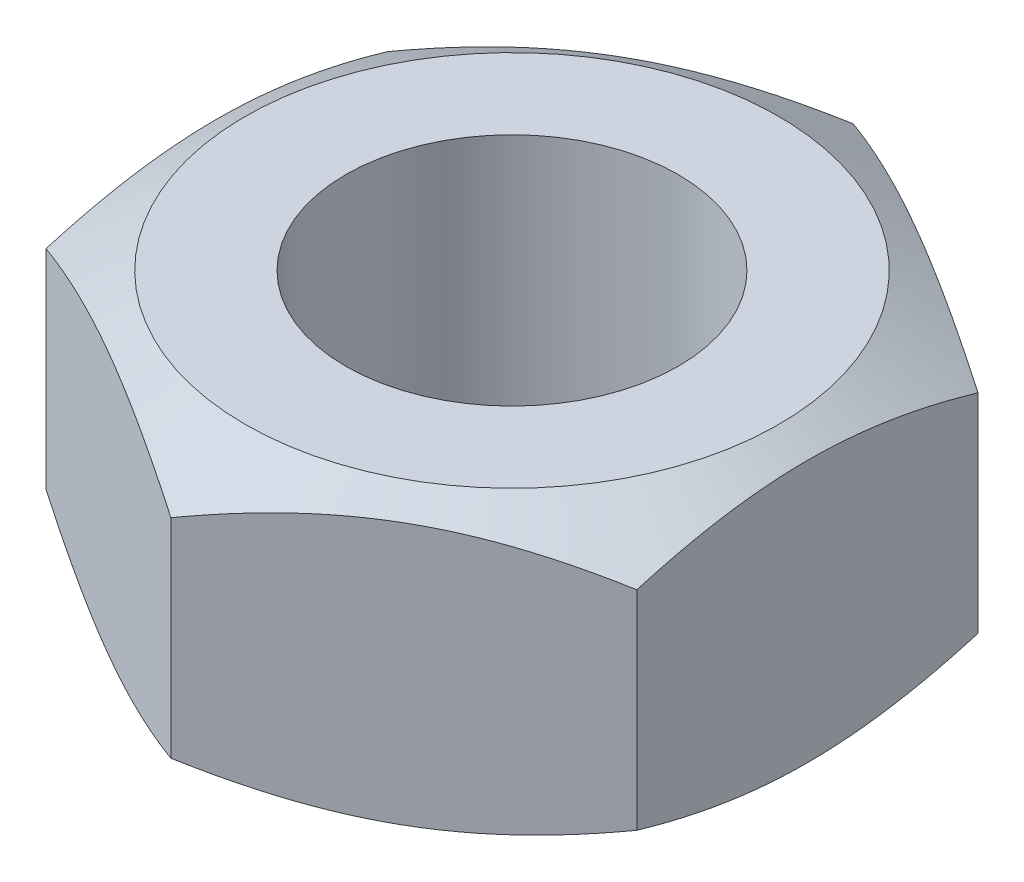
ISO-10303-21;
HEADER;
FILE_DESCRIPTION(('STEP AP214'),'2;1');
FILE_NAME('part.step','',(''),(''),'','','');
FILE_SCHEMA(('AUTOMOTIVE_DESIGN { 1 0 10303 214 1 1 1 1 }'));
ENDSEC;
DATA;
#1=APPLICATION_CONTEXT('core data for automotive mechanical design processes');
#2=APPLICATION_PROTOCOL_DEFINITION('international standard','automotive_design',2000,#1);
#3=PRODUCT_CONTEXT('',#1,'mechanical');
#4=PRODUCT('Part','Part','',(#3));
#5=PRODUCT_RELATED_PRODUCT_CATEGORY('part','',(#4));
#6=PRODUCT_DEFINITION_FORMATION('','',#4);
#7=PRODUCT_DEFINITION_CONTEXT('part definition',#1,'design');
#8=PRODUCT_DEFINITION('design','',#6,#7);
#9=PRODUCT_DEFINITION_SHAPE('','',#8);
#10=(LENGTH_UNIT() NAMED_UNIT(*) SI_UNIT(.MILLI.,.METRE.));
#11=(NAMED_UNIT(*) PLANE_ANGLE_UNIT() SI_UNIT($,.RADIAN.));
#12=(NAMED_UNIT(*) SI_UNIT($,.STERADIAN.) SOLID_ANGLE_UNIT());
#13=UNCERTAINTY_MEASURE_WITH_UNIT(LENGTH_MEASURE(1.E-05),#10,'distance_accuracy_value','');
#14=(GEOMETRIC_REPRESENTATION_CONTEXT(3) GLOBAL_UNCERTAINTY_ASSIGNED_CONTEXT((#13)) GLOBAL_UNIT_ASSIGNED_CONTEXT((#10,
#11,#12)) REPRESENTATION_CONTEXT('',''));
#15=CARTESIAN_POINT('',(0.,0.,0.));
#16=DIRECTION('',(0.,0.,1.));
#17=DIRECTION('',(1.,0.,0.));
#18=AXIS2_PLACEMENT_3D('',#15,#16,#17);
#19=CARTESIAN_POINT('',(0.,4.,0.));
#20=DIRECTION('',(0.,1.,0.));
#21=DIRECTION('',(0.,0.,1.));
#22=AXIS2_PLACEMENT_3D('',#19,#20,#21);
#23=PLANE('',#22);
#24=CARTESIAN_POINT('',(0.,4.,0.));
#25=DIRECTION('',(0.,1.,0.));
#26=DIRECTION('',(0.,0.,1.));
#27=AXIS2_PLACEMENT_3D('',#24,#25,#26);
#28=CIRCLE('',#27,2.25);
#29=CARTESIAN_POINT('',(0.,4.,2.25));
#30=VERTEX_POINT('',#29);
#31=EDGE_CURVE('E117',#30,#30,#28,.T.);
#32=ORIENTED_EDGE('',*,*,#31,.F.);
#33=EDGE_LOOP('',(#32));
#34=FACE_BOUND('',#33,.T.);
#35=CARTESIAN_POINT('',(0.,4.,0.));
#36=DIRECTION('',(0.,1.,0.));
#37=DIRECTION('',(0.,0.,1.));
#38=AXIS2_PLACEMENT_3D('',#35,#36,#37);
#39=CIRCLE('',#38,3.61209797008557);
#40=CARTESIAN_POINT('',(0.,4.,3.61209797008557));
#41=VERTEX_POINT('',#40);
#42=EDGE_CURVE('E206',#41,#41,#39,.F.);
#43=ORIENTED_EDGE('',*,*,#42,.F.);
#44=EDGE_LOOP('',(#43));
#45=FACE_BOUND('',#44,.T.);
#46=ADVANCED_FACE('F37',(#34,#45),#23,.T.);
#47=CARTESIAN_POINT('',(0.,0.,0.));
#48=DIRECTION('',(0.,1.,0.));
#49=DIRECTION('',(0.,0.,1.));
#50=AXIS2_PLACEMENT_3D('',#47,#48,#49);
#51=PLANE('',#50);
#52=CARTESIAN_POINT('',(0.,0.,0.));
#53=DIRECTION('',(0.,1.,0.));
#54=DIRECTION('',(0.,0.,1.));
#55=AXIS2_PLACEMENT_3D('',#52,#53,#54);
#56=CIRCLE('',#55,2.25);
#57=CARTESIAN_POINT('',(0.,0.,2.25));
#58=VERTEX_POINT('',#57);
#59=EDGE_CURVE('E209',#58,#58,#56,.T.);
#60=ORIENTED_EDGE('',*,*,#59,.T.);
#61=EDGE_LOOP('',(#60));
#62=FACE_BOUND('',#61,.T.);
#63=CARTESIAN_POINT('',(0.,0.,0.));
#64=DIRECTION('',(0.,1.,0.));
#65=DIRECTION('',(0.,0.,1.));
#66=AXIS2_PLACEMENT_3D('',#63,#64,#65);
#67=CIRCLE('',#66,3.61209797008557);
#68=CARTESIAN_POINT('',(0.,0.,3.61209797008557));
#69=VERTEX_POINT('',#68);
#70=EDGE_CURVE('E240',#69,#69,#67,.F.);
#71=ORIENTED_EDGE('',*,*,#70,.T.);
#72=EDGE_LOOP('',(#71));
#73=FACE_BOUND('',#72,.T.);
#74=ADVANCED_FACE('F214',(#62,#73),#51,.F.);
#75=CARTESIAN_POINT('',(0.,4.,0.));
#76=DIRECTION('',(0.,-1.,0.));
#77=DIRECTION('',(0.,0.,-1.));
#78=AXIS2_PLACEMENT_3D('',#75,#76,#77);
#79=CYLINDRICAL_SURFACE('',#78,2.25);
#80=ORIENTED_EDGE('',*,*,#31,.T.);
#81=EDGE_LOOP('',(#80));
#82=FACE_BOUND('',#81,.T.);
#83=ORIENTED_EDGE('',*,*,#59,.F.);
#84=EDGE_LOOP('',(#83));
#85=FACE_BOUND('',#84,.T.);
#86=ADVANCED_FACE('F139',(#82,#85),#79,.F.);
#87=CARTESIAN_POINT('',(0.,-0.68376443772911,0.));
#88=DIRECTION('',(0.,1.,0.));
#89=DIRECTION('',(0.,0.,1.));
#90=AXIS2_PLACEMENT_3D('',#87,#88,#89);
#91=CONICAL_SURFACE('',#90,2.4447269690735,1.0409354159188);
#92=CARTESIAN_POINT('',(4.,2.61028718759325,7.00726327897921));
#93=CARTESIAN_POINT('',(4.,2.52639827824864,6.84232589552048));
#94=CARTESIAN_POINT('',(4.,2.44306760311003,6.67710171603951));
#95=CARTESIAN_POINT('',(4.,2.27779120456628,6.3459563996271));
#96=CARTESIAN_POINT('',(4.,2.19584552263047,6.1800352420119));
#97=CARTESIAN_POINT('',(4.,2.03345876510597,5.84706693247022));
#98=CARTESIAN_POINT('',(4.,1.95302083859972,5.68001824163056));
#99=CARTESIAN_POINT('',(4.,1.79417526159156,5.34495366362033));
#100=CARTESIAN_POINT('',(4.,1.71576764042466,5.17693776251778));
#101=CARTESIAN_POINT('',(4.,1.55789573304698,4.83199690750797));
#102=CARTESIAN_POINT('',(4.,1.47854903734373,4.65501796380072));
#103=CARTESIAN_POINT('',(4.,1.32328560860535,4.29956340195523));
#104=CARTESIAN_POINT('',(4.,1.24736876337757,4.12108783299931));
#105=CARTESIAN_POINT('',(4.,1.09993305319936,3.76247333013967));
#106=CARTESIAN_POINT('',(4.,1.02841096395531,3.58233572997014));
#107=CARTESIAN_POINT('',(4.,0.890895088142785,3.21989853901179));
#108=CARTESIAN_POINT('',(4.,0.824902765013513,3.03759839039016));
#109=CARTESIAN_POINT('',(4.,0.685758042436417,2.62861099875536));
#110=CARTESIAN_POINT('',(4.,0.614413825843176,2.40129732545409));
#111=CARTESIAN_POINT('',(4.,0.486235081572712,1.94267549399183));
#112=CARTESIAN_POINT('',(4.,0.429392492990072,1.71136963161924));
#113=CARTESIAN_POINT('',(4.,0.335503107936436,1.24874583177107));
#114=CARTESIAN_POINT('',(4.,0.298133387909005,1.01749619795472));
#115=CARTESIAN_POINT('',(4.,0.258784993512926,0.668801688350013));
#116=CARTESIAN_POINT('',(4.,0.248453307084588,0.552271632402245));
#117=CARTESIAN_POINT('',(4.,0.233656567288959,0.318845081866252));
#118=CARTESIAN_POINT('',(4.,0.229190743544397,0.201948637418405));
#119=CARTESIAN_POINT('',(4.,0.226267362822431,-0.0328811107374999));
#120=CARTESIAN_POINT('',(4.,0.227859552541684,-0.150815030619628));
#121=CARTESIAN_POINT('',(4.,0.237107225154616,-0.386443176088084));
#122=CARTESIAN_POINT('',(4.,0.244762746675399,-0.504137400142615));
#123=CARTESIAN_POINT('',(4.,0.26588840700443,-0.73903203220059));
#124=CARTESIAN_POINT('',(4.,0.27936018176286,-0.856232291893325));
#125=CARTESIAN_POINT('',(4.,0.311708432806887,-1.0898907321352));
#126=CARTESIAN_POINT('',(4.,0.330585690262064,-1.20634880293898));
#127=CARTESIAN_POINT('',(4.,0.39532456241445,-1.55845850653768));
#128=CARTESIAN_POINT('',(4.,0.448891679379593,-1.79270738631452));
#129=CARTESIAN_POINT('',(4.,0.57168084833591,-2.25695035701157));
#130=CARTESIAN_POINT('',(4.,0.640904747324168,-2.4869439424781));
#131=CARTESIAN_POINT('',(4.,0.778494266831522,-2.90519380379463));
#132=CARTESIAN_POINT('',(4.,0.845094289386991,-3.09403992717374));
#133=CARTESIAN_POINT('',(4.,0.984552173797888,-3.46941862759845));
#134=CARTESIAN_POINT('',(4.,1.05741084236691,-3.65595090284177));
#135=CARTESIAN_POINT('',(4.,1.2080196332473,-4.02716204183718));
#136=CARTESIAN_POINT('',(4.,1.28577297789606,-4.21183958981844));
#137=CARTESIAN_POINT('',(4.,1.4450720715363,-4.57955338136123));
#138=CARTESIAN_POINT('',(4.,1.52661796781677,-4.76258956084811));
#139=CARTESIAN_POINT('',(4.,1.68892399921445,-5.11899619775736));
#140=CARTESIAN_POINT('',(4.,1.76955103188059,-5.29242747885545));
#141=CARTESIAN_POINT('',(4.,1.93300933732775,-5.6382507194435));
#142=CARTESIAN_POINT('',(4.,2.01584065798741,-5.81064265625827));
#143=CARTESIAN_POINT('',(4.,2.1831068753491,-6.15416446950149));
#144=CARTESIAN_POINT('',(4.,2.26753773800244,-6.32529631447043));
#145=CARTESIAN_POINT('',(4.,2.43787752539434,-6.66680796247699));
#146=CARTESIAN_POINT('',(4.,2.52378634336737,-6.83718781872926));
#147=CARTESIAN_POINT('',(4.,2.61028718759325,-7.00726327897921));
#148=B_SPLINE_CURVE_WITH_KNOTS('',3,(#92,#93,#94,#95,#96,#97,#98,#99,#100,#101,#102,#103,#104,
#105,#106,#107,#108,#109,#110,#111,#112,#113,#114,#115,#116,#117,#118,#119,#120,#121,#122,#123,
#124,#125,#126,#127,#128,#129,#130,#131,#132,#133,#134,#135,#136,#137,#138,#139,#140,#141,#142,
#143,#144,#145,#146,#147),.UNSPECIFIED.,.F.,.F.,(4,2,2,2,2,2,2,2,2,2,2,2,2,2,2,2,2,2,2,2,2,2,2,
2,2,2,2,4),(0.,0.555138054664007,1.11029270186784,1.66650046328751,2.22271625663643,
2.80454385050609,3.38635239861735,3.96772886607925,4.54925871064816,5.26363404959649,
5.97761142488807,6.67933831072323,7.03017313355102,7.3809618758241,7.73463738899631,
8.08831515531428,8.44209246622222,8.79592092883722,9.51600624319177,10.2361765488178,
10.8367810583951,11.4374630999085,12.0385448130504,12.6396498895591,13.2134015875616,
13.7871657580345,14.3596370232447,14.9320671061052),.UNSPECIFIED.);
#149=CARTESIAN_POINT('',(4.,0.58965703220853,2.3094010767592));
#150=VERTEX_POINT('',#149);
#151=CARTESIAN_POINT('',(4.,0.589657032208923,-2.3094010767585));
#152=VERTEX_POINT('',#151);
#153=EDGE_CURVE('E52',#150,#152,#148,.T.);
#154=ORIENTED_EDGE('',*,*,#153,.F.);
#155=CARTESIAN_POINT('',(-0.000200000000001371,0.589724669041671,4.61891762357084));
#156=CARTESIAN_POINT('',(0.175804831431018,0.530183688208346,4.51730118676547));
#157=CARTESIAN_POINT('',(0.353373387179112,0.476024892513993,4.4147819333047));
#158=CARTESIAN_POINT('',(0.711678957166684,0.381500126417072,4.20791411602023));
#159=CARTESIAN_POINT('',(0.892422759342489,0.341168832353252,4.10356163317967));
#160=CARTESIAN_POINT('',(1.25160420033593,0.278464674315939,3.89618813153419));
#161=CARTESIAN_POINT('',(1.42998324919891,0.255660398584664,3.79320093965536));
#162=CARTESIAN_POINT('',(1.78759849441755,0.228537723528707,3.58673168156206));
#163=CARTESIAN_POINT('',(1.96683330903635,0.224195807285599,3.48325041309375));
#164=CARTESIAN_POINT('',(2.30117127720475,0.233694291050728,3.29022029717141));
#165=CARTESIAN_POINT('',(2.45632863986722,0.245204283483477,3.20064015207148));
#166=CARTESIAN_POINT('',(2.76560140614868,0.281529574357058,3.02208143720586));
#167=CARTESIAN_POINT('',(2.91971567223493,0.306357578340221,2.933103524195));
#168=CARTESIAN_POINT('',(3.22963813865317,0.368367007743517,2.75416970478052));
#169=CARTESIAN_POINT('',(3.3854049694151,0.405816924592417,2.66423768310931));
#170=CARTESIAN_POINT('',(3.69455409582105,0.490760079003086,2.48575035175909));
#171=CARTESIAN_POINT('',(3.84794058217129,0.538232820830941,2.39719262257473));
#172=CARTESIAN_POINT('',(4.0002,0.589724669041671,2.30928560670467));
#173=B_SPLINE_CURVE_WITH_KNOTS('',3,(#155,#156,#157,#158,#159,#160,#161,#162,#163,#164,#165,
#166,#167,#168,#169,#170,#171,#172),.UNSPECIFIED.,.F.,.F.,(4,2,2,2,2,2,2,2,4),(0.,
0.63558616227486,1.27275477200873,1.89368771411415,2.51382948909345,3.05189428800758,
3.5904733225053,4.14131948105499,4.69104993616021),.UNSPECIFIED.);
#174=CARTESIAN_POINT('',(0.,0.589657032208924,4.61880215351701));
#175=VERTEX_POINT('',#174);
#176=EDGE_CURVE('E96',#175,#150,#173,.T.);
#177=ORIENTED_EDGE('',*,*,#176,.F.);
#178=CARTESIAN_POINT('',(-4.0002,0.589724669041671,2.30928560670467));
#179=CARTESIAN_POINT('',(-3.82419516856898,0.530183688208346,2.41090204351004));
#180=CARTESIAN_POINT('',(-3.64662661282089,0.476024892513993,2.51342129697081));
#181=CARTESIAN_POINT('',(-3.28832104283331,0.381500126417072,2.72028911425528));
#182=CARTESIAN_POINT('',(-3.10757724065751,0.341168832353252,2.82464159709584));
#183=CARTESIAN_POINT('',(-2.74839579966407,0.278464674315939,3.03201509874132));
#184=CARTESIAN_POINT('',(-2.57001675080109,0.255660398584665,3.13500229062015));
#185=CARTESIAN_POINT('',(-2.21240150558245,0.228537723528707,3.34147154871344));
#186=CARTESIAN_POINT('',(-2.03316669096365,0.224195807285599,3.44495281718176));
#187=CARTESIAN_POINT('',(-1.69882872279525,0.233694291050728,3.6379829331041));
#188=CARTESIAN_POINT('',(-1.54367136013278,0.245204283483477,3.72756307820403));
#189=CARTESIAN_POINT('',(-1.23439859385132,0.281529574357058,3.90612179306965));
#190=CARTESIAN_POINT('',(-1.08028432776507,0.306357578340222,3.99509970608051));
#191=CARTESIAN_POINT('',(-0.770361861346834,0.368367007743517,4.17403352549499));
#192=CARTESIAN_POINT('',(-0.614595030584906,0.405816924592416,4.26396554716621));
#193=CARTESIAN_POINT('',(-0.305445904178949,0.490760079003085,4.44245287851642));
#194=CARTESIAN_POINT('',(-0.152059417828715,0.538232820830941,4.53101060770078));
#195=CARTESIAN_POINT('',(0.000199999999997758,0.589724669041671,4.61891762357084));
#196=B_SPLINE_CURVE_WITH_KNOTS('',3,(#178,#179,#180,#181,#182,#183,#184,#185,#186,#187,#188,
#189,#190,#191,#192,#193,#194,#195),.UNSPECIFIED.,.F.,.F.,(4,2,2,2,2,2,2,2,4),(0.,
0.63558616227486,1.27275477200874,1.89368771411415,2.51382948909345,3.05189428800758,
3.5904733225053,4.14131948105499,4.69104993616021),.UNSPECIFIED.);
#197=CARTESIAN_POINT('',(-4.,0.589657032208924,2.3094010767585));
#198=VERTEX_POINT('',#197);
#199=EDGE_CURVE('E110',#198,#175,#196,.T.);
#200=ORIENTED_EDGE('',*,*,#199,.F.);
#201=CARTESIAN_POINT('',(-4.,2.61028718759325,-7.00726327897921));
#202=CARTESIAN_POINT('',(-4.,2.52639827824864,-6.84232589552048));
#203=CARTESIAN_POINT('',(-4.,2.44306760311003,-6.6771017160395));
#204=CARTESIAN_POINT('',(-4.,2.27779120456628,-6.3459563996271));
#205=CARTESIAN_POINT('',(-4.,2.19584552263047,-6.1800352420119));
#206=CARTESIAN_POINT('',(-4.,2.03345876510597,-5.84706693247022));
#207=CARTESIAN_POINT('',(-4.,1.95302083859972,-5.68001824163056));
#208=CARTESIAN_POINT('',(-4.,1.79417526159156,-5.34495366362033));
#209=CARTESIAN_POINT('',(-4.,1.71576764042466,-5.17693776251777));
#210=CARTESIAN_POINT('',(-4.,1.55789573304698,-4.83199690750797));
#211=CARTESIAN_POINT('',(-4.,1.47854903734373,-4.65501796380072));
#212=CARTESIAN_POINT('',(-4.,1.32328560860535,-4.29956340195523));
#213=CARTESIAN_POINT('',(-4.,1.24736876337757,-4.12108783299931));
#214=CARTESIAN_POINT('',(-4.,1.09993305319936,-3.76247333013967));
#215=CARTESIAN_POINT('',(-4.,1.02841096395531,-3.58233572997014));
#216=CARTESIAN_POINT('',(-4.,0.890895088142785,-3.21989853901179));
#217=CARTESIAN_POINT('',(-4.,0.824902765013513,-3.03759839039016));
#218=CARTESIAN_POINT('',(-4.,0.685758042436418,-2.62861099875536));
#219=CARTESIAN_POINT('',(-4.,0.614413825843176,-2.4012973254541));
#220=CARTESIAN_POINT('',(-4.,0.486235081572713,-1.94267549399183));
#221=CARTESIAN_POINT('',(-4.,0.429392492990072,-1.71136963161925));
#222=CARTESIAN_POINT('',(-4.,0.335503107936436,-1.24874583177107));
#223=CARTESIAN_POINT('',(-4.,0.298133387909005,-1.01749619795472));
#224=CARTESIAN_POINT('',(-4.,0.258784993512926,-0.668801688350014));
#225=CARTESIAN_POINT('',(-4.,0.248453307084588,-0.552271632402245));
#226=CARTESIAN_POINT('',(-4.,0.233656567288959,-0.318845081866252));
#227=CARTESIAN_POINT('',(-4.,0.229190743544397,-0.201948637418404));
#228=CARTESIAN_POINT('',(-4.,0.226267362822432,0.0328811107375005));
#229=CARTESIAN_POINT('',(-4.,0.227859552541684,0.150815030619629));
#230=CARTESIAN_POINT('',(-4.,0.237107225154617,0.386443176088085));
#231=CARTESIAN_POINT('',(-4.,0.244762746675399,0.504137400142616));
#232=CARTESIAN_POINT('',(-4.,0.265888407004431,0.739032032200591));
#233=CARTESIAN_POINT('',(-4.,0.27936018176286,0.856232291893325));
#234=CARTESIAN_POINT('',(-4.,0.311708432806887,1.0898907321352));
#235=CARTESIAN_POINT('',(-4.,0.330585690262065,1.20634880293898));
#236=CARTESIAN_POINT('',(-4.,0.395324562414451,1.55845850653768));
#237=CARTESIAN_POINT('',(-4.,0.448891679379594,1.79270738631452));
#238=CARTESIAN_POINT('',(-4.,0.57168084833591,2.25695035701158));
#239=CARTESIAN_POINT('',(-4.,0.640904747324168,2.4869439424781));
#240=CARTESIAN_POINT('',(-4.,0.778494266831523,2.90519380379463));
#241=CARTESIAN_POINT('',(-4.,0.845094289386992,3.09403992717374));
#242=CARTESIAN_POINT('',(-4.,0.984552173797889,3.46941862759846));
#243=CARTESIAN_POINT('',(-4.,1.05741084236691,3.65595090284178));
#244=CARTESIAN_POINT('',(-4.,1.2080196332473,4.02716204183718));
#245=CARTESIAN_POINT('',(-4.,1.28577297789607,4.21183958981844));
#246=CARTESIAN_POINT('',(-4.,1.4450720715363,4.57955338136123));
#247=CARTESIAN_POINT('',(-4.,1.52661796781677,4.76258956084811));
#248=CARTESIAN_POINT('',(-4.,1.68892399921445,5.11899619775736));
#249=CARTESIAN_POINT('',(-4.,1.76955103188059,5.29242747885545));
#250=CARTESIAN_POINT('',(-4.,1.93300933732775,5.63825071944351));
#251=CARTESIAN_POINT('',(-4.,2.01584065798741,5.81064265625827));
#252=CARTESIAN_POINT('',(-4.,2.1831068753491,6.15416446950149));
#253=CARTESIAN_POINT('',(-4.,2.26753773800244,6.32529631447043));
#254=CARTESIAN_POINT('',(-4.,2.43787752539435,6.66680796247699));
#255=CARTESIAN_POINT('',(-4.,2.52378634336737,6.83718781872926));
#256=CARTESIAN_POINT('',(-4.,2.61028718759325,7.00726327897921));
#257=B_SPLINE_CURVE_WITH_KNOTS('',3,(#201,#202,#203,#204,#205,#206,#207,#208,#209,#210,#211,
#212,#213,#214,#215,#216,#217,#218,#219,#220,#221,#222,#223,#224,#225,#226,#227,#228,#229,#230,
#231,#232,#233,#234,#235,#236,#237,#238,#239,#240,#241,#242,#243,#244,#245,#246,#247,#248,#249,
#250,#251,#252,#253,#254,#255,#256),.UNSPECIFIED.,.F.,.F.,(4,2,2,2,2,2,2,2,2,2,2,2,2,2,2,2,2,2,
2,2,2,2,2,2,2,2,2,4),(0.,0.555138054664008,1.11029270186784,1.66650046328751,2.22271625663643,
2.80454385050609,3.38635239861735,3.96772886607925,4.54925871064816,5.26363404959649,
5.97761142488807,6.67933831072323,7.03017313355102,7.3809618758241,7.73463738899631,
8.08831515531429,8.44209246622223,8.79592092883722,9.51600624319177,10.2361765488178,
10.8367810583951,11.4374630999086,12.0385448130504,12.6396498895591,13.2134015875616,
13.7871657580345,14.3596370232447,14.9320671061052),.UNSPECIFIED.);
#258=CARTESIAN_POINT('',(-4.,0.58965703220853,-2.3094010767592));
#259=VERTEX_POINT('',#258);
#260=EDGE_CURVE('E159',#259,#198,#257,.T.);
#261=ORIENTED_EDGE('',*,*,#260,.F.);
#262=CARTESIAN_POINT('',(0.000199999999999149,0.589724669041671,-4.61891762357084));
#263=CARTESIAN_POINT('',(-0.17580483143102,0.530183688208346,-4.51730118676547));
#264=CARTESIAN_POINT('',(-0.353373387179115,0.476024892513993,-4.4147819333047));
#265=CARTESIAN_POINT('',(-0.711678957166686,0.381500126417072,-4.20791411602023));
#266=CARTESIAN_POINT('',(-0.892422759342491,0.341168832353251,-4.10356163317967));
#267=CARTESIAN_POINT('',(-1.25160420033593,0.278464674315939,-3.89618813153419));
#268=CARTESIAN_POINT('',(-1.42998324919891,0.255660398584664,-3.79320093965536));
#269=CARTESIAN_POINT('',(-1.78759849441755,0.228537723528707,-3.58673168156207));
#270=CARTESIAN_POINT('',(-1.96683330903635,0.224195807285599,-3.48325041309375));
#271=CARTESIAN_POINT('',(-2.30117127720475,0.233694291050729,-3.29022029717141));
#272=CARTESIAN_POINT('',(-2.45632863986722,0.245204283483477,-3.20064015207148));
#273=CARTESIAN_POINT('',(-2.76560140614868,0.281529574357059,-3.02208143720586));
#274=CARTESIAN_POINT('',(-2.91971567223494,0.306357578340222,-2.933103524195));
#275=CARTESIAN_POINT('',(-3.22963813865317,0.368367007743518,-2.75416970478052));
#276=CARTESIAN_POINT('',(-3.3854049694151,0.405816924592417,-2.66423768310931));
#277=CARTESIAN_POINT('',(-3.69455409582105,0.490760079003086,-2.48575035175909));
#278=CARTESIAN_POINT('',(-3.84794058217129,0.538232820830941,-2.39719262257473));
#279=CARTESIAN_POINT('',(-4.0002,0.589724669041671,-2.30928560670467));
#280=B_SPLINE_CURVE_WITH_KNOTS('',3,(#262,#263,#264,#265,#266,#267,#268,#269,#270,#271,#272,
#273,#274,#275,#276,#277,#278,#279),.UNSPECIFIED.,.F.,.F.,(4,2,2,2,2,2,2,2,4),(0.,
0.63558616227486,1.27275477200874,1.89368771411415,2.51382948909345,3.05189428800758,
3.5904733225053,4.14131948105499,4.69104993616021),.UNSPECIFIED.);
#281=CARTESIAN_POINT('',(0.,0.589657032208924,-4.61880215351701));
#282=VERTEX_POINT('',#281);
#283=EDGE_CURVE('E166',#282,#259,#280,.T.);
#284=ORIENTED_EDGE('',*,*,#283,.F.);
#285=CARTESIAN_POINT('',(4.0002,0.589724669041671,-2.30928560670467));
#286=CARTESIAN_POINT('',(3.82419516856898,0.530183688208345,-2.41090204351004));
#287=CARTESIAN_POINT('',(3.64662661282088,0.476024892513993,-2.51342129697082));
#288=CARTESIAN_POINT('',(3.28832104283331,0.381500126417071,-2.72028911425528));
#289=CARTESIAN_POINT('',(3.10757724065751,0.341168832353251,-2.82464159709584));
#290=CARTESIAN_POINT('',(2.74839579966407,0.278464674315939,-3.03201509874132));
#291=CARTESIAN_POINT('',(2.57001675080109,0.255660398584664,-3.13500229062015));
#292=CARTESIAN_POINT('',(2.21240150558245,0.228537723528707,-3.34147154871344));
#293=CARTESIAN_POINT('',(2.03316669096365,0.224195807285599,-3.44495281718176));
#294=CARTESIAN_POINT('',(1.69882872279525,0.233694291050728,-3.6379829331041));
#295=CARTESIAN_POINT('',(1.54367136013278,0.245204283483477,-3.72756307820403));
#296=CARTESIAN_POINT('',(1.23439859385132,0.281529574357058,-3.90612179306965));
#297=CARTESIAN_POINT('',(1.08028432776506,0.306357578340221,-3.99509970608051));
#298=CARTESIAN_POINT('',(0.770361861346831,0.368367007743517,-4.17403352549499));
#299=CARTESIAN_POINT('',(0.614595030584903,0.405816924592416,-4.26396554716621));
#300=CARTESIAN_POINT('',(0.305445904178946,0.490760079003085,-4.44245287851642));
#301=CARTESIAN_POINT('',(0.152059417828711,0.53823282083094,-4.53101060770078));
#302=CARTESIAN_POINT('',(-0.000200000000000805,0.589724669041671,-4.61891762357084));
#303=B_SPLINE_CURVE_WITH_KNOTS('',3,(#285,#286,#287,#288,#289,#290,#291,#292,#293,#294,#295,
#296,#297,#298,#299,#300,#301,#302),.UNSPECIFIED.,.F.,.F.,(4,2,2,2,2,2,2,2,4),(0.,
0.63558616227486,1.27275477200873,1.89368771411415,2.51382948909345,3.05189428800758,
3.5904733225053,4.14131948105499,4.69104993616021),.UNSPECIFIED.);
#304=EDGE_CURVE('E66',#152,#282,#303,.T.);
#305=ORIENTED_EDGE('',*,*,#304,.F.);
#306=EDGE_LOOP('',(#154,#177,#200,#261,#284,#305));
#307=FACE_BOUND('',#306,.T.);
#308=ORIENTED_EDGE('',*,*,#70,.F.);
#309=EDGE_LOOP('',(#308));
#310=FACE_BOUND('',#309,.T.);
#311=ADVANCED_FACE('F94',(#307,#310),#91,.T.);
#312=CARTESIAN_POINT('',(0.,3.14285541894045,0.));
#313=DIRECTION('',(0.,-1.,0.));
#314=DIRECTION('',(0.,0.,-1.));
#315=AXIS2_PLACEMENT_3D('',#312,#313,#314);
#316=CONICAL_SURFACE('',#315,5.07547581249973,1.0409354159188);
#317=ORIENTED_EDGE('',*,*,#42,.T.);
#318=EDGE_LOOP('',(#317));
#319=FACE_BOUND('',#318,.T.);
#320=CARTESIAN_POINT('',(-4.0002,3.41027533095833,-2.30928560670467));
#321=CARTESIAN_POINT('',(-3.82419516856898,3.46981631179165,-2.41090204351004));
#322=CARTESIAN_POINT('',(-3.64662661282089,3.52397510748601,-2.51342129697082));
#323=CARTESIAN_POINT('',(-3.28832104283331,3.61849987358293,-2.72028911425528));
#324=CARTESIAN_POINT('',(-3.10757724065751,3.65883116764675,-2.82464159709584));
#325=CARTESIAN_POINT('',(-2.74839579966407,3.72153532568406,-3.03201509874132));
#326=CARTESIAN_POINT('',(-2.57001675080109,3.74433960141534,-3.13500229062015));
#327=CARTESIAN_POINT('',(-2.21240150558245,3.77146227647129,-3.34147154871345));
#328=CARTESIAN_POINT('',(-2.03316669096365,3.7758041927144,-3.44495281718176));
#329=CARTESIAN_POINT('',(-1.69882872279525,3.76630570894927,-3.6379829331041));
#330=CARTESIAN_POINT('',(-1.54367136013278,3.75479571651652,-3.72756307820403));
#331=CARTESIAN_POINT('',(-1.23439859385132,3.71847042564294,-3.90612179306965));
#332=CARTESIAN_POINT('',(-1.08028432776507,3.69364242165978,-3.99509970608051));
#333=CARTESIAN_POINT('',(-0.770361861346833,3.63163299225648,-4.17403352549499));
#334=CARTESIAN_POINT('',(-0.614595030584905,3.59418307540758,-4.26396554716621));
#335=CARTESIAN_POINT('',(-0.305445904178948,3.50923992099692,-4.44245287851642));
#336=CARTESIAN_POINT('',(-0.152059417828713,3.46176717916906,-4.53101060770078));
#337=CARTESIAN_POINT('',(0.000199999999998861,3.41027533095833,-4.61891762357084));
#338=B_SPLINE_CURVE_WITH_KNOTS('',3,(#320,#321,#322,#323,#324,#325,#326,#327,#328,#329,#330,
#331,#332,#333,#334,#335,#336,#337),.UNSPECIFIED.,.F.,.F.,(4,2,2,2,2,2,2,2,4),(0.,
0.635586162274861,1.27275477200874,1.89368771411415,2.51382948909345,3.05189428800758,
3.5904733225053,4.14131948105499,4.69104993616021),.UNSPECIFIED.);
#339=CARTESIAN_POINT('',(-4.,3.41034296779112,-2.30940107675858));
#340=VERTEX_POINT('',#339);
#341=CARTESIAN_POINT('',(0.,3.41034296779108,-4.61880215351701));
#342=VERTEX_POINT('',#341);
#343=EDGE_CURVE('E185',#340,#342,#338,.T.);
#344=ORIENTED_EDGE('',*,*,#343,.F.);
#345=CARTESIAN_POINT('',(-4.,1.38971281240675,7.00726327897921));
#346=CARTESIAN_POINT('',(-4.,1.47360172175136,6.84232589552048));
#347=CARTESIAN_POINT('',(-4.,1.55693239688997,6.6771017160395));
#348=CARTESIAN_POINT('',(-4.,1.72220879543372,6.3459563996271));
#349=CARTESIAN_POINT('',(-4.,1.80415447736953,6.1800352420119));
#350=CARTESIAN_POINT('',(-4.,1.96654123489403,5.84706693247022));
#351=CARTESIAN_POINT('',(-4.,2.04697916140028,5.68001824163056));
#352=CARTESIAN_POINT('',(-4.,2.20582473840844,5.34495366362033));
#353=CARTESIAN_POINT('',(-4.,2.28423235957534,5.17693776251777));
#354=CARTESIAN_POINT('',(-4.,2.44210426695302,4.83199690750797));
#355=CARTESIAN_POINT('',(-4.,2.52145096265627,4.65501796380072));
#356=CARTESIAN_POINT('',(-4.,2.67671439139465,4.29956340195522));
#357=CARTESIAN_POINT('',(-4.,2.75263123662243,4.12108783299931));
#358=CARTESIAN_POINT('',(-4.,2.90006694680064,3.76247333013967));
#359=CARTESIAN_POINT('',(-4.,2.9715890360447,3.58233572997014));
#360=CARTESIAN_POINT('',(-4.,3.10910491185722,3.21989853901179));
#361=CARTESIAN_POINT('',(-4.,3.17509723498649,3.03759839039016));
#362=CARTESIAN_POINT('',(-4.,3.31424195756358,2.62861099875536));
#363=CARTESIAN_POINT('',(-4.,3.38558617415682,2.40129732545409));
#364=CARTESIAN_POINT('',(-4.,3.51376491842729,1.94267549399183));
#365=CARTESIAN_POINT('',(-4.,3.57060750700993,1.71136963161924));
#366=CARTESIAN_POINT('',(-4.,3.66449689206356,1.24874583177107));
#367=CARTESIAN_POINT('',(-4.,3.701866612091,1.01749619795472));
#368=CARTESIAN_POINT('',(-4.,3.74121500648707,0.668801688350013));
#369=CARTESIAN_POINT('',(-4.,3.75154669291541,0.552271632402244));
#370=CARTESIAN_POINT('',(-4.,3.76634343271104,0.318845081866251));
#371=CARTESIAN_POINT('',(-4.,3.7708092564556,0.201948637418403));
#372=CARTESIAN_POINT('',(-4.,3.77373263717757,-0.0328811107375018));
#373=CARTESIAN_POINT('',(-4.,3.77214044745832,-0.15081503061963));
#374=CARTESIAN_POINT('',(-4.,3.76289277484538,-0.386443176088087));
#375=CARTESIAN_POINT('',(-4.,3.7552372533246,-0.504137400142618));
#376=CARTESIAN_POINT('',(-4.,3.73411159299557,-0.739032032200593));
#377=CARTESIAN_POINT('',(-4.,3.72063981823714,-0.856232291893328));
#378=CARTESIAN_POINT('',(-4.,3.68829156719311,-1.0898907321352));
#379=CARTESIAN_POINT('',(-4.,3.66941430973794,-1.20634880293899));
#380=CARTESIAN_POINT('',(-4.,3.60467543758555,-1.55845850653768));
#381=CARTESIAN_POINT('',(-4.,3.55110832062041,-1.79270738631453));
#382=CARTESIAN_POINT('',(-4.,3.42831915166409,-2.25695035701158));
#383=CARTESIAN_POINT('',(-4.,3.35909525267583,-2.4869439424781));
#384=CARTESIAN_POINT('',(-4.,3.22150573316848,-2.90519380379463));
#385=CARTESIAN_POINT('',(-4.,3.15490571061301,-3.09403992717374));
#386=CARTESIAN_POINT('',(-4.,3.01544782620211,-3.46941862759845));
#387=CARTESIAN_POINT('',(-4.,2.94258915763309,-3.65595090284178));
#388=CARTESIAN_POINT('',(-4.,2.7919803667527,-4.02716204183718));
#389=CARTESIAN_POINT('',(-4.,2.71422702210393,-4.21183958981844));
#390=CARTESIAN_POINT('',(-4.,2.5549279284637,-4.57955338136123));
#391=CARTESIAN_POINT('',(-4.,2.47338203218323,-4.76258956084811));
#392=CARTESIAN_POINT('',(-4.,2.31107600078555,-5.11899619775736));
#393=CARTESIAN_POINT('',(-4.,2.23044896811941,-5.29242747885545));
#394=CARTESIAN_POINT('',(-4.,2.06699066267225,-5.6382507194435));
#395=CARTESIAN_POINT('',(-4.,1.98415934201259,-5.81064265625827));
#396=CARTESIAN_POINT('',(-4.,1.8168931246509,-6.15416446950149));
#397=CARTESIAN_POINT('',(-4.,1.73246226199756,-6.32529631447043));
#398=CARTESIAN_POINT('',(-4.,1.56212247460565,-6.66680796247699));
#399=CARTESIAN_POINT('',(-4.,1.47621365663263,-6.83718781872926));
#400=CARTESIAN_POINT('',(-4.,1.38971281240675,-7.00726327897921));
#401=B_SPLINE_CURVE_WITH_KNOTS('',3,(#345,#346,#347,#348,#349,#350,#351,#352,#353,#354,#355,
#356,#357,#358,#359,#360,#361,#362,#363,#364,#365,#366,#367,#368,#369,#370,#371,#372,#373,#374,
#375,#376,#377,#378,#379,#380,#381,#382,#383,#384,#385,#386,#387,#388,#389,#390,#391,#392,#393,
#394,#395,#396,#397,#398,#399,#400),.UNSPECIFIED.,.F.,.F.,(4,2,2,2,2,2,2,2,2,2,2,2,2,2,2,2,2,2,
2,2,2,2,2,2,2,2,2,4),(0.,0.555138054664009,1.11029270186784,1.66650046328751,2.22271625663643,
2.80454385050609,3.38635239861735,3.96772886607925,4.54925871064816,5.26363404959649,
5.97761142488807,6.67933831072323,7.03017313355102,7.3809618758241,7.73463738899631,
8.08831515531429,8.44209246622223,8.79592092883722,9.51600624319177,10.2361765488178,
10.8367810583951,11.4374630999086,12.0385448130504,12.6396498895591,13.2134015875616,
13.7871657580345,14.3596370232447,14.9320671061052),.UNSPECIFIED.);
#402=CARTESIAN_POINT('',(-4.,3.41034296779108,2.3094010767585));
#403=VERTEX_POINT('',#402);
#404=EDGE_CURVE('E194',#403,#340,#401,.T.);
#405=ORIENTED_EDGE('',*,*,#404,.F.);
#406=CARTESIAN_POINT('',(0.000199999999998638,3.41027533095833,4.61891762357084));
#407=CARTESIAN_POINT('',(-0.175804831431021,3.46981631179165,4.51730118676547));
#408=CARTESIAN_POINT('',(-0.353373387179116,3.52397510748601,4.4147819333047));
#409=CARTESIAN_POINT('',(-0.711678957166687,3.61849987358293,4.20791411602023));
#410=CARTESIAN_POINT('',(-0.892422759342493,3.65883116764675,4.10356163317967));
#411=CARTESIAN_POINT('',(-1.25160420033594,3.72153532568406,3.89618813153419));
#412=CARTESIAN_POINT('',(-1.42998324919891,3.74433960141534,3.79320093965536));
#413=CARTESIAN_POINT('',(-1.78759849441755,3.77146227647129,3.58673168156206));
#414=CARTESIAN_POINT('',(-1.96683330903635,3.7758041927144,3.48325041309375));
#415=CARTESIAN_POINT('',(-2.30117127720475,3.76630570894927,3.29022029717141));
#416=CARTESIAN_POINT('',(-2.45632863986723,3.75479571651652,3.20064015207148));
#417=CARTESIAN_POINT('',(-2.76560140614868,3.71847042564294,3.02208143720586));
#418=CARTESIAN_POINT('',(-2.91971567223494,3.69364242165978,2.933103524195));
#419=CARTESIAN_POINT('',(-3.22963813865317,3.63163299225648,2.75416970478052));
#420=CARTESIAN_POINT('',(-3.3854049694151,3.59418307540758,2.6642376831093));
#421=CARTESIAN_POINT('',(-3.69455409582105,3.50923992099692,2.48575035175909));
#422=CARTESIAN_POINT('',(-3.84794058217129,3.46176717916906,2.39719262257473));
#423=CARTESIAN_POINT('',(-4.0002,3.41027533095833,2.30928560670467));
#424=B_SPLINE_CURVE_WITH_KNOTS('',3,(#406,#407,#408,#409,#410,#411,#412,#413,#414,#415,#416,
#417,#418,#419,#420,#421,#422,#423),.UNSPECIFIED.,.F.,.F.,(4,2,2,2,2,2,2,2,4),(0.,
0.635586162274861,1.27275477200874,1.89368771411415,2.51382948909345,3.05189428800758,
3.5904733225053,4.14131948105499,4.69104993616021),.UNSPECIFIED.);
#425=CARTESIAN_POINT('',(0.,3.41034296779108,4.61880215351701));
#426=VERTEX_POINT('',#425);
#427=EDGE_CURVE('E238',#426,#403,#424,.T.);
#428=ORIENTED_EDGE('',*,*,#427,.F.);
#429=CARTESIAN_POINT('',(4.0002,3.41027533095833,2.30928560670467));
#430=CARTESIAN_POINT('',(3.82419516856898,3.46981631179165,2.41090204351004));
#431=CARTESIAN_POINT('',(3.64662661282088,3.52397510748601,2.51342129697082));
#432=CARTESIAN_POINT('',(3.28832104283331,3.61849987358293,2.72028911425528));
#433=CARTESIAN_POINT('',(3.10757724065751,3.65883116764675,2.82464159709584));
#434=CARTESIAN_POINT('',(2.74839579966407,3.72153532568406,3.03201509874132));
#435=CARTESIAN_POINT('',(2.57001675080109,3.74433960141534,3.13500229062015));
#436=CARTESIAN_POINT('',(2.21240150558245,3.77146227647129,3.34147154871345));
#437=CARTESIAN_POINT('',(2.03316669096365,3.7758041927144,3.44495281718176));
#438=CARTESIAN_POINT('',(1.69882872279525,3.76630570894927,3.6379829331041));
#439=CARTESIAN_POINT('',(1.54367136013278,3.75479571651652,3.72756307820403));
#440=CARTESIAN_POINT('',(1.23439859385132,3.71847042564294,3.90612179306965));
#441=CARTESIAN_POINT('',(1.08028432776506,3.69364242165978,3.99509970608051));
#442=CARTESIAN_POINT('',(0.770361861346831,3.63163299225648,4.17403352549499));
#443=CARTESIAN_POINT('',(0.614595030584903,3.59418307540758,4.26396554716621));
#444=CARTESIAN_POINT('',(0.305445904178947,3.50923992099692,4.44245287851642));
#445=CARTESIAN_POINT('',(0.152059417828712,3.46176717916906,4.53101060770078));
#446=CARTESIAN_POINT('',(-0.000200000000001059,3.41027533095833,4.61891762357084));
#447=B_SPLINE_CURVE_WITH_KNOTS('',3,(#429,#430,#431,#432,#433,#434,#435,#436,#437,#438,#439,
#440,#441,#442,#443,#444,#445,#446),.UNSPECIFIED.,.F.,.F.,(4,2,2,2,2,2,2,2,4),(0.,
0.635586162274861,1.27275477200874,1.89368771411415,2.51382948909345,3.05189428800758,
3.5904733225053,4.14131948105499,4.69104993616021),.UNSPECIFIED.);
#448=CARTESIAN_POINT('',(4.,3.41034296779108,2.3094010767585));
#449=VERTEX_POINT('',#448);
#450=EDGE_CURVE('E59',#449,#426,#447,.T.);
#451=ORIENTED_EDGE('',*,*,#450,.F.);
#452=CARTESIAN_POINT('',(4.,1.38971281240675,-7.00726327897921));
#453=CARTESIAN_POINT('',(4.,1.47360172175136,-6.84232589552048));
#454=CARTESIAN_POINT('',(4.,1.55693239688997,-6.6771017160395));
#455=CARTESIAN_POINT('',(4.,1.72220879543372,-6.3459563996271));
#456=CARTESIAN_POINT('',(4.,1.80415447736953,-6.1800352420119));
#457=CARTESIAN_POINT('',(4.,1.96654123489403,-5.84706693247022));
#458=CARTESIAN_POINT('',(4.,2.04697916140028,-5.68001824163056));
#459=CARTESIAN_POINT('',(4.,2.20582473840844,-5.34495366362033));
#460=CARTESIAN_POINT('',(4.,2.28423235957534,-5.17693776251777));
#461=CARTESIAN_POINT('',(4.,2.44210426695302,-4.83199690750797));
#462=CARTESIAN_POINT('',(4.,2.52145096265627,-4.65501796380072));
#463=CARTESIAN_POINT('',(4.,2.67671439139465,-4.29956340195522));
#464=CARTESIAN_POINT('',(4.,2.75263123662243,-4.12108783299931));
#465=CARTESIAN_POINT('',(4.,2.90006694680064,-3.76247333013967));
#466=CARTESIAN_POINT('',(4.,2.9715890360447,-3.58233572997014));
#467=CARTESIAN_POINT('',(4.,3.10910491185722,-3.21989853901179));
#468=CARTESIAN_POINT('',(4.,3.17509723498649,-3.03759839039016));
#469=CARTESIAN_POINT('',(4.,3.31424195756358,-2.62861099875536));
#470=CARTESIAN_POINT('',(4.,3.38558617415682,-2.40129732545409));
#471=CARTESIAN_POINT('',(4.,3.51376491842729,-1.94267549399183));
#472=CARTESIAN_POINT('',(4.,3.57060750700993,-1.71136963161924));
#473=CARTESIAN_POINT('',(4.,3.66449689206356,-1.24874583177107));
#474=CARTESIAN_POINT('',(4.,3.701866612091,-1.01749619795472));
#475=CARTESIAN_POINT('',(4.,3.74121500648708,-0.668801688350013));
#476=CARTESIAN_POINT('',(4.,3.75154669291541,-0.552271632402245));
#477=CARTESIAN_POINT('',(4.,3.76634343271104,-0.318845081866252));
#478=CARTESIAN_POINT('',(4.,3.7708092564556,-0.201948637418405));
#479=CARTESIAN_POINT('',(4.,3.77373263717757,0.0328811107375004));
#480=CARTESIAN_POINT('',(4.,3.77214044745832,0.150815030619629));
#481=CARTESIAN_POINT('',(4.,3.76289277484538,0.386443176088085));
#482=CARTESIAN_POINT('',(4.,3.7552372533246,0.504137400142616));
#483=CARTESIAN_POINT('',(4.,3.73411159299557,0.739032032200591));
#484=CARTESIAN_POINT('',(4.,3.72063981823714,0.856232291893325));
#485=CARTESIAN_POINT('',(4.,3.68829156719311,1.0898907321352));
#486=CARTESIAN_POINT('',(4.,3.66941430973794,1.20634880293898));
#487=CARTESIAN_POINT('',(4.,3.60467543758555,1.55845850653768));
#488=CARTESIAN_POINT('',(4.,3.55110832062041,1.79270738631452));
#489=CARTESIAN_POINT('',(4.,3.42831915166409,2.25695035701158));
#490=CARTESIAN_POINT('',(4.,3.35909525267583,2.4869439424781));
#491=CARTESIAN_POINT('',(4.,3.22150573316848,2.90519380379463));
#492=CARTESIAN_POINT('',(4.,3.15490571061301,3.09403992717374));
#493=CARTESIAN_POINT('',(4.,3.01544782620211,3.46941862759845));
#494=CARTESIAN_POINT('',(4.,2.94258915763309,3.65595090284177));
#495=CARTESIAN_POINT('',(4.,2.7919803667527,4.02716204183718));
#496=CARTESIAN_POINT('',(4.,2.71422702210393,4.21183958981844));
#497=CARTESIAN_POINT('',(4.,2.5549279284637,4.57955338136123));
#498=CARTESIAN_POINT('',(4.,2.47338203218323,4.76258956084811));
#499=CARTESIAN_POINT('',(4.,2.31107600078555,5.11899619775736));
#500=CARTESIAN_POINT('',(4.,2.23044896811941,5.29242747885545));
#501=CARTESIAN_POINT('',(4.,2.06699066267225,5.6382507194435));
#502=CARTESIAN_POINT('',(4.,1.98415934201259,5.81064265625827));
#503=CARTESIAN_POINT('',(4.,1.8168931246509,6.15416446950149));
#504=CARTESIAN_POINT('',(4.,1.73246226199756,6.32529631447043));
#505=CARTESIAN_POINT('',(4.,1.56212247460565,6.66680796247699));
#506=CARTESIAN_POINT('',(4.,1.47621365663263,6.83718781872926));
#507=CARTESIAN_POINT('',(4.,1.38971281240675,7.00726327897921));
#508=B_SPLINE_CURVE_WITH_KNOTS('',3,(#452,#453,#454,#455,#456,#457,#458,#459,#460,#461,#462,
#463,#464,#465,#466,#467,#468,#469,#470,#471,#472,#473,#474,#475,#476,#477,#478,#479,#480,#481,
#482,#483,#484,#485,#486,#487,#488,#489,#490,#491,#492,#493,#494,#495,#496,#497,#498,#499,#500,
#501,#502,#503,#504,#505,#506,#507),.UNSPECIFIED.,.F.,.F.,(4,2,2,2,2,2,2,2,2,2,2,2,2,2,2,2,2,2,
2,2,2,2,2,2,2,2,2,4),(0.,0.555138054664008,1.11029270186784,1.66650046328751,2.22271625663643,
2.80454385050609,3.38635239861735,3.96772886607925,4.54925871064816,5.26363404959649,
5.97761142488807,6.67933831072323,7.03017313355102,7.3809618758241,7.73463738899631,
8.08831515531429,8.44209246622222,8.79592092883722,9.51600624319177,10.2361765488178,
10.8367810583951,11.4374630999085,12.0385448130504,12.6396498895591,13.2134015875616,
13.7871657580345,14.3596370232447,14.9320671061052),.UNSPECIFIED.);
#509=CARTESIAN_POINT('',(4.,3.41034296779147,-2.3094010767592));
#510=VERTEX_POINT('',#509);
#511=EDGE_CURVE('E11',#510,#449,#508,.T.);
#512=ORIENTED_EDGE('',*,*,#511,.F.);
#513=CARTESIAN_POINT('',(-0.00020000000000086,3.41027533095833,-4.61891762357084));
#514=CARTESIAN_POINT('',(0.175804831431019,3.46981631179165,-4.51730118676547));
#515=CARTESIAN_POINT('',(0.353373387179113,3.52397510748601,-4.41478193330469));
#516=CARTESIAN_POINT('',(0.711678957166685,3.61849987358293,-4.20791411602023));
#517=CARTESIAN_POINT('',(0.89242275934249,3.65883116764675,-4.10356163317967));
#518=CARTESIAN_POINT('',(1.25160420033593,3.72153532568406,-3.89618813153419));
#519=CARTESIAN_POINT('',(1.42998324919891,3.74433960141534,-3.79320093965536));
#520=CARTESIAN_POINT('',(1.78759849441755,3.77146227647129,-3.58673168156206));
#521=CARTESIAN_POINT('',(1.96683330903635,3.7758041927144,-3.48325041309375));
#522=CARTESIAN_POINT('',(2.30117127720475,3.76630570894927,-3.29022029717141));
#523=CARTESIAN_POINT('',(2.45632863986722,3.75479571651652,-3.20064015207148));
#524=CARTESIAN_POINT('',(2.76560140614868,3.71847042564294,-3.02208143720586));
#525=CARTESIAN_POINT('',(2.91971567223493,3.69364242165978,-2.933103524195));
#526=CARTESIAN_POINT('',(3.22963813865317,3.63163299225648,-2.75416970478052));
#527=CARTESIAN_POINT('',(3.38540496941509,3.59418307540758,-2.6642376831093));
#528=CARTESIAN_POINT('',(3.69455409582105,3.50923992099692,-2.48575035175909));
#529=CARTESIAN_POINT('',(3.84794058217129,3.46176717916906,-2.39719262257473));
#530=CARTESIAN_POINT('',(4.0002,3.41027533095833,-2.30928560670467));
#531=B_SPLINE_CURVE_WITH_KNOTS('',3,(#513,#514,#515,#516,#517,#518,#519,#520,#521,#522,#523,
#524,#525,#526,#527,#528,#529,#530),.UNSPECIFIED.,.F.,.F.,(4,2,2,2,2,2,2,2,4),(0.,
0.63558616227486,1.27275477200874,1.89368771411415,2.51382948909345,3.05189428800758,
3.5904733225053,4.14131948105499,4.69104993616021),.UNSPECIFIED.);
#532=EDGE_CURVE('E193',#342,#510,#531,.T.);
#533=ORIENTED_EDGE('',*,*,#532,.F.);
#534=EDGE_LOOP('',(#344,#405,#428,#451,#512,#533));
#535=FACE_BOUND('',#534,.T.);
#536=ADVANCED_FACE('F138',(#319,#535),#316,.T.);
#537=CARTESIAN_POINT('',(4.,4.,2.3094010767585));
#538=DIRECTION('',(-1.,0.,0.));
#539=DIRECTION('',(0.,0.,1.));
#540=AXIS2_PLACEMENT_3D('',#537,#538,#539);
#541=PLANE('',#540);
#542=DIRECTION('',(0.,-1.,0.));
#543=VECTOR('',#542,1.);
#544=CARTESIAN_POINT('',(4.,4.,-2.3094010767585));
#545=LINE('',#544,#543);
#546=EDGE_CURVE('E113',#510,#152,#545,.T.);
#547=ORIENTED_EDGE('',*,*,#546,.F.);
#548=ORIENTED_EDGE('',*,*,#511,.T.);
#549=DIRECTION('',(0.,-1.,0.));
#550=VECTOR('',#549,1.);
#551=CARTESIAN_POINT('',(4.,4.,2.3094010767585));
#552=LINE('',#551,#550);
#553=EDGE_CURVE('E107',#449,#150,#552,.T.);
#554=ORIENTED_EDGE('',*,*,#553,.T.);
#555=ORIENTED_EDGE('',*,*,#153,.T.);
#556=EDGE_LOOP('',(#547,#548,#554,#555));
#557=FACE_BOUND('',#556,.T.);
#558=ADVANCED_FACE('F112',(#557),#541,.F.);
#559=CARTESIAN_POINT('',(0.,4.,4.61880215351701));
#560=DIRECTION('',(-0.5,0.,-0.866025403784439));
#561=DIRECTION('',(-0.866025403784439,0.,0.5));
#562=AXIS2_PLACEMENT_3D('',#559,#560,#561);
#563=PLANE('',#562);
#564=ORIENTED_EDGE('',*,*,#553,.F.);
#565=ORIENTED_EDGE('',*,*,#450,.T.);
#566=DIRECTION('',(0.,-1.,0.));
#567=VECTOR('',#566,1.);
#568=CARTESIAN_POINT('',(0.,4.,4.61880215351701));
#569=LINE('',#568,#567);
#570=EDGE_CURVE('E109',#426,#175,#569,.T.);
#571=ORIENTED_EDGE('',*,*,#570,.T.);
#572=ORIENTED_EDGE('',*,*,#176,.T.);
#573=EDGE_LOOP('',(#564,#565,#571,#572));
#574=FACE_BOUND('',#573,.T.);
#575=ADVANCED_FACE('F106',(#574),#563,.F.);
#576=CARTESIAN_POINT('',(-4.,4.,2.3094010767585));
#577=DIRECTION('',(0.5,0.,-0.866025403784439));
#578=DIRECTION('',(-0.866025403784439,0.,-0.5));
#579=AXIS2_PLACEMENT_3D('',#576,#577,#578);
#580=PLANE('',#579);
#581=ORIENTED_EDGE('',*,*,#570,.F.);
#582=ORIENTED_EDGE('',*,*,#427,.T.);
#583=DIRECTION('',(0.,-1.,0.));
#584=VECTOR('',#583,1.);
#585=CARTESIAN_POINT('',(-4.,4.,2.3094010767585));
#586=LINE('',#585,#584);
#587=EDGE_CURVE('E115',#403,#198,#586,.T.);
#588=ORIENTED_EDGE('',*,*,#587,.T.);
#589=ORIENTED_EDGE('',*,*,#199,.T.);
#590=EDGE_LOOP('',(#581,#582,#588,#589));
#591=FACE_BOUND('',#590,.T.);
#592=ADVANCED_FACE('F254',(#591),#580,.F.);
#593=CARTESIAN_POINT('',(-4.,4.,-2.3094010767585));
#594=DIRECTION('',(1.,0.,0.));
#595=DIRECTION('',(0.,0.,-1.));
#596=AXIS2_PLACEMENT_3D('',#593,#594,#595);
#597=PLANE('',#596);
#598=ORIENTED_EDGE('',*,*,#587,.F.);
#599=ORIENTED_EDGE('',*,*,#404,.T.);
#600=DIRECTION('',(0.,-1.,0.));
#601=VECTOR('',#600,1.);
#602=CARTESIAN_POINT('',(-4.,4.,-2.3094010767585));
#603=LINE('',#602,#601);
#604=EDGE_CURVE('E123',#340,#259,#603,.T.);
#605=ORIENTED_EDGE('',*,*,#604,.T.);
#606=ORIENTED_EDGE('',*,*,#260,.T.);
#607=EDGE_LOOP('',(#598,#599,#605,#606));
#608=FACE_BOUND('',#607,.T.);
#609=ADVANCED_FACE('F180',(#608),#597,.F.);
#610=CARTESIAN_POINT('',(0.,4.,-4.61880215351701));
#611=DIRECTION('',(0.5,0.,0.866025403784439));
#612=DIRECTION('',(0.866025403784439,0.,-0.5));
#613=AXIS2_PLACEMENT_3D('',#610,#611,#612);
#614=PLANE('',#613);
#615=ORIENTED_EDGE('',*,*,#604,.F.);
#616=ORIENTED_EDGE('',*,*,#343,.T.);
#617=DIRECTION('',(0.,-1.,0.));
#618=VECTOR('',#617,1.);
#619=CARTESIAN_POINT('',(0.,4.,-4.61880215351701));
#620=LINE('',#619,#618);
#621=EDGE_CURVE('E102',#342,#282,#620,.T.);
#622=ORIENTED_EDGE('',*,*,#621,.T.);
#623=ORIENTED_EDGE('',*,*,#283,.T.);
#624=EDGE_LOOP('',(#615,#616,#622,#623));
#625=FACE_BOUND('',#624,.T.);
#626=ADVANCED_FACE('F177',(#625),#614,.F.);
#627=CARTESIAN_POINT('',(4.,4.,-2.3094010767585));
#628=DIRECTION('',(-0.5,0.,0.866025403784439));
#629=DIRECTION('',(0.866025403784439,0.,0.5));
#630=AXIS2_PLACEMENT_3D('',#627,#628,#629);
#631=PLANE('',#630);
#632=ORIENTED_EDGE('',*,*,#621,.F.);
#633=ORIENTED_EDGE('',*,*,#532,.T.);
#634=ORIENTED_EDGE('',*,*,#546,.T.);
#635=ORIENTED_EDGE('',*,*,#304,.T.);
#636=EDGE_LOOP('',(#632,#633,#634,#635));
#637=FACE_BOUND('',#636,.T.);
#638=ADVANCED_FACE('F39',(#637),#631,.F.);
#639=CLOSED_SHELL('',(#46,#74,#86,#311,#536,#558,#575,#592,#609,#626,#638));
#640=MANIFOLD_SOLID_BREP('B2',#639);
#641=ADVANCED_BREP_SHAPE_REPRESENTATION('',(#18,#640),#14);
#642=SHAPE_DEFINITION_REPRESENTATION(#9,#641);
ENDSEC;
END-ISO-10303-21;
